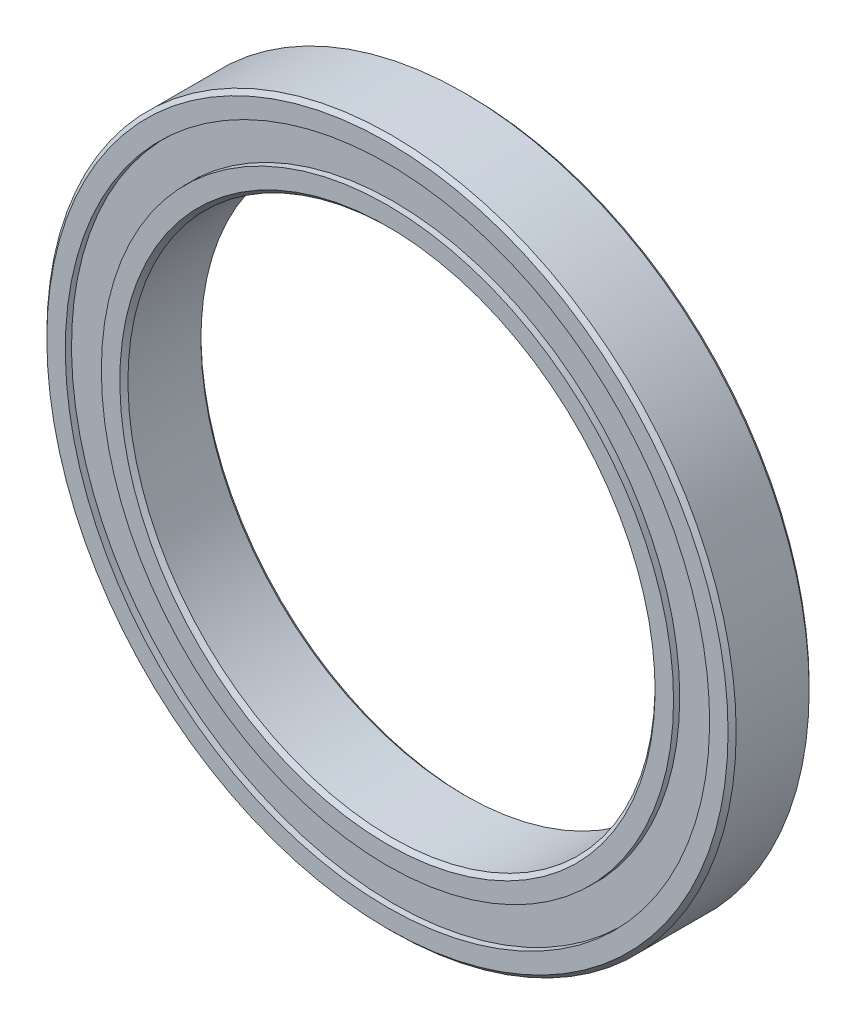
ISO-10303-21;
HEADER;
FILE_DESCRIPTION(('STEP AP214'),'2;1');
FILE_NAME('part.step','',(''),(''),'','','');
FILE_SCHEMA(('AUTOMOTIVE_DESIGN { 1 0 10303 214 1 1 1 1 }'));
ENDSEC;
DATA;
#1=APPLICATION_CONTEXT('core data for automotive mechanical design processes');
#2=APPLICATION_PROTOCOL_DEFINITION('international standard','automotive_design',2000,#1);
#3=PRODUCT_CONTEXT('',#1,'mechanical');
#4=PRODUCT('Part','Part','',(#3));
#5=PRODUCT_RELATED_PRODUCT_CATEGORY('part','',(#4));
#6=PRODUCT_DEFINITION_FORMATION('','',#4);
#7=PRODUCT_DEFINITION_CONTEXT('part definition',#1,'design');
#8=PRODUCT_DEFINITION('design','',#6,#7);
#9=PRODUCT_DEFINITION_SHAPE('','',#8);
#10=(LENGTH_UNIT() NAMED_UNIT(*) SI_UNIT(.MILLI.,.METRE.));
#11=(NAMED_UNIT(*) PLANE_ANGLE_UNIT() SI_UNIT($,.RADIAN.));
#12=(NAMED_UNIT(*) SI_UNIT($,.STERADIAN.) SOLID_ANGLE_UNIT());
#13=UNCERTAINTY_MEASURE_WITH_UNIT(LENGTH_MEASURE(1.E-05),#10,'distance_accuracy_value','');
#14=(GEOMETRIC_REPRESENTATION_CONTEXT(3) GLOBAL_UNCERTAINTY_ASSIGNED_CONTEXT((#13)) GLOBAL_UNIT_ASSIGNED_CONTEXT((#10,
#11,#12)) REPRESENTATION_CONTEXT('',''));
#15=CARTESIAN_POINT('',(0.,0.,0.));
#16=DIRECTION('',(0.,0.,1.));
#17=DIRECTION('',(1.,0.,0.));
#18=AXIS2_PLACEMENT_3D('',#15,#16,#17);
#19=CARTESIAN_POINT('',(10.1173789183879,36.1093982755426,0.));
#20=DIRECTION('',(0.,0.,1.));
#21=DIRECTION('',(0.269796771157012,0.962917287347803,0.));
#22=AXIS2_PLACEMENT_3D('',#19,#20,#21);
#23=SPHERICAL_SURFACE('',#22,3.14269680527354);
#24=CARTESIAN_POINT('',(10.1173789183879,36.1093982755426,3.14269680527354));
#25=VERTEX_POINT('',#24);
#26=VERTEX_LOOP('',#25);
#27=FACE_BOUND('',#26,.T.);
#28=ADVANCED_FACE('F47',(#27),#23,.T.);
#29=CLOSED_SHELL('',(#28));
#30=MANIFOLD_SOLID_BREP('B2',#29);
#31=CARTESIAN_POINT('',(19.4843981263284,32.0407276704936,0.));
#32=DIRECTION('',(0.,0.,1.));
#33=DIRECTION('',(0.519583950035423,0.854419404546495,0.));
#34=AXIS2_PLACEMENT_3D('',#31,#32,#33);
#35=SPHERICAL_SURFACE('',#34,3.14269680527354);
#36=CARTESIAN_POINT('',(19.4843981263284,32.0407276704936,3.14269680527354));
#37=VERTEX_POINT('',#36);
#38=VERTEX_LOOP('',#37);
#39=FACE_BOUND('',#38,.T.);
#40=ADVANCED_FACE('F67',(#39),#35,.T.);
#41=CLOSED_SHELL('',(#40));
#42=MANIFOLD_SOLID_BREP('B6',#41);
#43=CARTESIAN_POINT('',(27.4063486604294,25.5957428706999,0.));
#44=DIRECTION('',(0.,0.,1.));
#45=DIRECTION('',(0.730835964278116,0.682553143218663,0.));
#46=AXIS2_PLACEMENT_3D('',#43,#44,#45);
#47=SPHERICAL_SURFACE('',#46,3.14269680527354);
#48=CARTESIAN_POINT('',(27.4063486604294,25.5957428706999,3.14269680527354));
#49=VERTEX_POINT('',#48);
#50=VERTEX_LOOP('',#49);
#51=FACE_BOUND('',#50,.T.);
#52=ADVANCED_FACE('F87',(#51),#47,.T.);
#53=CLOSED_SHELL('',(#52));
#54=MANIFOLD_SOLID_BREP('B43',#53);
#55=CARTESIAN_POINT('',(33.2956956900889,17.2524389149186,0.));
#56=DIRECTION('',(0.,0.,1.));
#57=DIRECTION('',(0.88788521840237,0.460065037731162,0.));
#58=AXIS2_PLACEMENT_3D('',#55,#56,#57);
#59=SPHERICAL_SURFACE('',#58,3.14269680527354);
#60=CARTESIAN_POINT('',(33.2956956900889,17.2524389149186,3.14269680527354));
#61=VERTEX_POINT('',#60);
#62=VERTEX_LOOP('',#61);
#63=FACE_BOUND('',#62,.T.);
#64=ADVANCED_FACE('F107',(#63),#59,.T.);
#65=CLOSED_SHELL('',(#64));
#66=MANIFOLD_SOLID_BREP('B63',#65);
#67=CARTESIAN_POINT('',(36.715653288087,7.62960048947418,0.));
#68=DIRECTION('',(0.,0.,1.));
#69=DIRECTION('',(0.979084087682321,0.203456013052645,0.));
#70=AXIS2_PLACEMENT_3D('',#67,#68,#69);
#71=SPHERICAL_SURFACE('',#70,3.14269680527354);
#72=CARTESIAN_POINT('',(36.715653288087,7.62960048947418,3.14269680527354));
#73=VERTEX_POINT('',#72);
#74=VERTEX_LOOP('',#73);
#75=FACE_BOUND('',#74,.T.);
#76=ADVANCED_FACE('F127',(#75),#71,.T.);
#77=CLOSED_SHELL('',(#76));
#78=MANIFOLD_SOLID_BREP('B83',#77);
#79=CARTESIAN_POINT('',(37.4125788446453,-2.55909050117478,0.));
#80=DIRECTION('',(0.,0.,1.));
#81=DIRECTION('',(0.99766876919054,-0.0682424133646607,0.));
#82=AXIS2_PLACEMENT_3D('',#79,#80,#81);
#83=SPHERICAL_SURFACE('',#82,3.14269680527354);
#84=CARTESIAN_POINT('',(37.4125788446453,-2.55909050117478,3.14269680527354));
#85=VERTEX_POINT('',#84);
#86=VERTEX_LOOP('',#85);
#87=FACE_BOUND('',#86,.T.);
#88=ADVANCED_FACE('F147',(#87),#83,.T.);
#89=CLOSED_SHELL('',(#88));
#90=MANIFOLD_SOLID_BREP('B103',#89);
#91=CARTESIAN_POINT('',(35.3347845794559,-12.5579854564116,0.));
#92=DIRECTION('',(0.,0.,1.));
#93=DIRECTION('',(0.942260922118824,-0.334879612170977,0.));
#94=AXIS2_PLACEMENT_3D('',#91,#92,#93);
#95=SPHERICAL_SURFACE('',#94,3.14269680527354);
#96=CARTESIAN_POINT('',(35.3347845794559,-12.5579854564116,3.14269680527354));
#97=VERTEX_POINT('',#96);
#98=VERTEX_LOOP('',#97);
#99=FACE_BOUND('',#98,.T.);
#100=ADVANCED_FACE('F169',(#99),#95,.T.);
#101=CLOSED_SHELL('',(#100));
#102=MANIFOLD_SOLID_BREP('B123',#101);
#103=CARTESIAN_POINT('',(30.6363709878918,-21.6255120793073,0.));
#104=DIRECTION('',(0.,0.,1.));
#105=DIRECTION('',(0.816969893010447,-0.57668032211486,0.));
#106=AXIS2_PLACEMENT_3D('',#103,#104,#105);
#107=SPHERICAL_SURFACE('',#106,3.14269680527354);
#108=CARTESIAN_POINT('',(30.6363709878918,-21.6255120793073,3.14269680527353));
#109=VERTEX_POINT('',#108);
#110=VERTEX_LOOP('',#109);
#111=FACE_BOUND('',#110,.T.);
#112=ADVANCED_FACE('F191',(#111),#107,.T.);
#113=CLOSED_SHELL('',(#112));
#114=MANIFOLD_SOLID_BREP('B143',#113);
#115=CARTESIAN_POINT('',(23.6657979122272,-29.0891734014155,0.));
#116=DIRECTION('',(0.,0.,1.));
#117=DIRECTION('',(0.631087944326059,-0.775711290704414,0.));
#118=AXIS2_PLACEMENT_3D('',#115,#116,#117);
#119=SPHERICAL_SURFACE('',#118,3.14269680527354);
#120=CARTESIAN_POINT('',(23.6657979122272,-29.0891734014155,3.14269680527353));
#121=VERTEX_POINT('',#120);
#122=VERTEX_LOOP('',#121);
#123=FACE_BOUND('',#122,.T.);
#124=ADVANCED_FACE('F213',(#123),#119,.T.);
#125=CLOSED_SHELL('',(#124));
#126=MANIFOLD_SOLID_BREP('B165',#125);
#127=CARTESIAN_POINT('',(14.9400408692343,-34.3954238064544,0.));
#128=DIRECTION('',(0.,0.,1.));
#129=DIRECTION('',(0.398401089846249,-0.91721130150545,0.));
#130=AXIS2_PLACEMENT_3D('',#127,#128,#129);
#131=SPHERICAL_SURFACE('',#130,3.14269680527354);
#132=CARTESIAN_POINT('',(14.9400408692343,-34.3954238064544,3.14269680527353));
#133=VERTEX_POINT('',#132);
#134=VERTEX_LOOP('',#133);
#135=FACE_BOUND('',#134,.T.);
#136=ADVANCED_FACE('F235',(#135),#131,.T.);
#137=CLOSED_SHELL('',(#136));
#138=MANIFOLD_SOLID_BREP('B187',#137);
#139=CARTESIAN_POINT('',(5.10624934110952,-37.1507229763624,0.));
#140=DIRECTION('',(0.,0.,1.));
#141=DIRECTION('',(0.136166649096254,-0.99068594603633,0.));
#142=AXIS2_PLACEMENT_3D('',#139,#140,#141);
#143=SPHERICAL_SURFACE('',#142,3.14269680527354);
#144=CARTESIAN_POINT('',(5.10624934110952,-37.1507229763624,3.14269680527353));
#145=VERTEX_POINT('',#144);
#146=VERTEX_LOOP('',#145);
#147=FACE_BOUND('',#146,.T.);
#148=ADVANCED_FACE('F257',(#147),#143,.T.);
#149=CLOSED_SHELL('',(#148));
#150=MANIFOLD_SOLID_BREP('B209',#149);
#151=CARTESIAN_POINT('',(-5.106249341109,-37.1507229763624,0.));
#152=DIRECTION('',(0.,0.,1.));
#153=DIRECTION('',(-0.13616664909624,-0.990685946036332,0.));
#154=AXIS2_PLACEMENT_3D('',#151,#152,#153);
#155=SPHERICAL_SURFACE('',#154,3.14269680527354);
#156=CARTESIAN_POINT('',(-5.106249341109,-37.1507229763624,3.14269680527353));
#157=VERTEX_POINT('',#156);
#158=VERTEX_LOOP('',#157);
#159=FACE_BOUND('',#158,.T.);
#160=ADVANCED_FACE('F279',(#159),#155,.T.);
#161=CLOSED_SHELL('',(#160));
#162=MANIFOLD_SOLID_BREP('B231',#161);
#163=CARTESIAN_POINT('',(-14.9400408692339,-34.3954238064546,0.));
#164=DIRECTION('',(0.,0.,1.));
#165=DIRECTION('',(-0.398401089846236,-0.917211301505455,0.));
#166=AXIS2_PLACEMENT_3D('',#163,#164,#165);
#167=SPHERICAL_SURFACE('',#166,3.14269680527354);
#168=CARTESIAN_POINT('',(-14.9400408692339,-34.3954238064546,3.14269680527353));
#169=VERTEX_POINT('',#168);
#170=VERTEX_LOOP('',#169);
#171=FACE_BOUND('',#170,.T.);
#172=ADVANCED_FACE('F301',(#171),#167,.T.);
#173=CLOSED_SHELL('',(#172));
#174=MANIFOLD_SOLID_BREP('B253',#173);
#175=CARTESIAN_POINT('',(-23.6657979122268,-29.0891734014159,0.));
#176=DIRECTION('',(0.,0.,1.));
#177=DIRECTION('',(-0.631087944326049,-0.775711290704423,0.));
#178=AXIS2_PLACEMENT_3D('',#175,#176,#177);
#179=SPHERICAL_SURFACE('',#178,3.14269680527354);
#180=CARTESIAN_POINT('',(-23.6657979122268,-29.0891734014159,3.14269680527353));
#181=VERTEX_POINT('',#180);
#182=VERTEX_LOOP('',#181);
#183=FACE_BOUND('',#182,.T.);
#184=ADVANCED_FACE('F323',(#183),#179,.T.);
#185=CLOSED_SHELL('',(#184));
#186=MANIFOLD_SOLID_BREP('B275',#185);
#187=CARTESIAN_POINT('',(-30.6363709878915,-21.6255120793077,0.));
#188=DIRECTION('',(0.,0.,1.));
#189=DIRECTION('',(-0.816969893010439,-0.576680322114871,0.));
#190=AXIS2_PLACEMENT_3D('',#187,#188,#189);
#191=SPHERICAL_SURFACE('',#190,3.14269680527354);
#192=CARTESIAN_POINT('',(-30.6363709878915,-21.6255120793077,3.14269680527353));
#193=VERTEX_POINT('',#192);
#194=VERTEX_LOOP('',#193);
#195=FACE_BOUND('',#194,.T.);
#196=ADVANCED_FACE('F345',(#195),#191,.T.);
#197=CLOSED_SHELL('',(#196));
#198=MANIFOLD_SOLID_BREP('B297',#197);
#199=CARTESIAN_POINT('',(-35.3347845794557,-12.5579854564121,0.));
#200=DIRECTION('',(0.,0.,1.));
#201=DIRECTION('',(-0.942260922118819,-0.33487961217099,0.));
#202=AXIS2_PLACEMENT_3D('',#199,#200,#201);
#203=SPHERICAL_SURFACE('',#202,3.14269680527354);
#204=CARTESIAN_POINT('',(-35.3347845794557,-12.5579854564121,3.14269680527354));
#205=VERTEX_POINT('',#204);
#206=VERTEX_LOOP('',#205);
#207=FACE_BOUND('',#206,.T.);
#208=ADVANCED_FACE('F367',(#207),#203,.T.);
#209=CLOSED_SHELL('',(#208));
#210=MANIFOLD_SOLID_BREP('B319',#209);
#211=CARTESIAN_POINT('',(-37.4125788446452,-2.5590905011753,0.));
#212=DIRECTION('',(0.,0.,1.));
#213=DIRECTION('',(-0.997668769190539,-0.0682424133646747,0.));
#214=AXIS2_PLACEMENT_3D('',#211,#212,#213);
#215=SPHERICAL_SURFACE('',#214,3.14269680527354);
#216=CARTESIAN_POINT('',(-37.4125788446452,-2.5590905011753,3.14269680527354));
#217=VERTEX_POINT('',#216);
#218=VERTEX_LOOP('',#217);
#219=FACE_BOUND('',#218,.T.);
#220=ADVANCED_FACE('F389',(#219),#215,.T.);
#221=CLOSED_SHELL('',(#220));
#222=MANIFOLD_SOLID_BREP('B341',#221);
#223=CARTESIAN_POINT('',(-36.7156532880871,7.62960048947366,0.));
#224=DIRECTION('',(0.,0.,1.));
#225=DIRECTION('',(-0.979084087682323,0.203456013052631,0.));
#226=AXIS2_PLACEMENT_3D('',#223,#224,#225);
#227=SPHERICAL_SURFACE('',#226,3.14269680527354);
#228=CARTESIAN_POINT('',(-36.7156532880871,7.62960048947366,3.14269680527354));
#229=VERTEX_POINT('',#228);
#230=VERTEX_LOOP('',#229);
#231=FACE_BOUND('',#230,.T.);
#232=ADVANCED_FACE('F411',(#231),#227,.T.);
#233=CLOSED_SHELL('',(#232));
#234=MANIFOLD_SOLID_BREP('B363',#233);
#235=CARTESIAN_POINT('',(-33.2956956900891,17.2524389149181,0.));
#236=DIRECTION('',(0.,0.,1.));
#237=DIRECTION('',(-0.887885218402376,0.46006503773115,0.));
#238=AXIS2_PLACEMENT_3D('',#235,#236,#237);
#239=SPHERICAL_SURFACE('',#238,3.14269680527354);
#240=CARTESIAN_POINT('',(-33.2956956900891,17.2524389149181,3.14269680527354));
#241=VERTEX_POINT('',#240);
#242=VERTEX_LOOP('',#241);
#243=FACE_BOUND('',#242,.T.);
#244=ADVANCED_FACE('F433',(#243),#239,.T.);
#245=CLOSED_SHELL('',(#244));
#246=MANIFOLD_SOLID_BREP('B385',#245);
#247=CARTESIAN_POINT('',(-27.4063486604297,25.5957428706995,0.));
#248=DIRECTION('',(0.,0.,1.));
#249=DIRECTION('',(-0.730835964278125,0.682553143218653,0.));
#250=AXIS2_PLACEMENT_3D('',#247,#248,#249);
#251=SPHERICAL_SURFACE('',#250,3.14269680527354);
#252=CARTESIAN_POINT('',(-27.4063486604297,25.5957428706995,3.14269680527354));
#253=VERTEX_POINT('',#252);
#254=VERTEX_LOOP('',#253);
#255=FACE_BOUND('',#254,.T.);
#256=ADVANCED_FACE('F455',(#255),#251,.T.);
#257=CLOSED_SHELL('',(#256));
#258=MANIFOLD_SOLID_BREP('B407',#257);
#259=CARTESIAN_POINT('',(-19.4843981263288,32.0407276704933,0.));
#260=DIRECTION('',(0.,0.,1.));
#261=DIRECTION('',(-0.519583950035435,0.854419404546488,0.));
#262=AXIS2_PLACEMENT_3D('',#259,#260,#261);
#263=SPHERICAL_SURFACE('',#262,3.14269680527354);
#264=CARTESIAN_POINT('',(-19.4843981263288,32.0407276704933,3.14269680527354));
#265=VERTEX_POINT('',#264);
#266=VERTEX_LOOP('',#265);
#267=FACE_BOUND('',#266,.T.);
#268=ADVANCED_FACE('F477',(#267),#263,.T.);
#269=CLOSED_SHELL('',(#268));
#270=MANIFOLD_SOLID_BREP('B429',#269);
#271=CARTESIAN_POINT('',(-10.1173789183884,36.1093982755425,0.));
#272=DIRECTION('',(0.,0.,1.));
#273=DIRECTION('',(-0.269796771157025,0.962917287347799,0.));
#274=AXIS2_PLACEMENT_3D('',#271,#272,#273);
#275=SPHERICAL_SURFACE('',#274,3.14269680527354);
#276=CARTESIAN_POINT('',(-10.1173789183884,36.1093982755425,3.14269680527354));
#277=VERTEX_POINT('',#276);
#278=VERTEX_LOOP('',#277);
#279=FACE_BOUND('',#278,.T.);
#280=ADVANCED_FACE('F499',(#279),#275,.T.);
#281=CLOSED_SHELL('',(#280));
#282=MANIFOLD_SOLID_BREP('B451',#281);
#283=CARTESIAN_POINT('',(0.,37.5,0.));
#284=DIRECTION('',(0.,0.,1.));
#285=DIRECTION('',(0.,1.,0.));
#286=AXIS2_PLACEMENT_3D('',#283,#284,#285);
#287=SPHERICAL_SURFACE('',#286,3.14269680527354);
#288=CARTESIAN_POINT('',(0.,37.5,3.14269680527354));
#289=VERTEX_POINT('',#288);
#290=VERTEX_LOOP('',#289);
#291=FACE_BOUND('',#290,.T.);
#292=ADVANCED_FACE('F523',(#291),#287,.T.);
#293=CLOSED_SHELL('',(#292));
#294=MANIFOLD_SOLID_BREP('B473',#293);
#295=CARTESIAN_POINT('',(0.,35.2777777777778,5.00000000000002));
#296=DIRECTION('',(0.,0.,-1.));
#297=DIRECTION('',(0.,1.,0.));
#298=AXIS2_PLACEMENT_3D('',#295,#296,#297);
#299=PLANE('',#298);
#300=CARTESIAN_POINT('',(0.,0.,5.00000000000002));
#301=DIRECTION('',(0.,0.,1.));
#302=DIRECTION('',(0.,-1.,0.));
#303=AXIS2_PLACEMENT_3D('',#300,#301,#302);
#304=CIRCLE('',#303,33.);
#305=CARTESIAN_POINT('',(0.,-33.,5.00000000000002));
#306=VERTEX_POINT('',#305);
#307=EDGE_CURVE('E582',#306,#306,#304,.T.);
#308=ORIENTED_EDGE('',*,*,#307,.F.);
#309=EDGE_LOOP('',(#308));
#310=FACE_BOUND('',#309,.T.);
#311=CARTESIAN_POINT('',(0.,0.,5.00000000000002));
#312=DIRECTION('',(0.,0.,1.));
#313=DIRECTION('',(0.,-1.,0.));
#314=AXIS2_PLACEMENT_3D('',#311,#312,#313);
#315=CIRCLE('',#314,35.2777777777778);
#316=CARTESIAN_POINT('',(0.,-35.2777777777778,5.00000000000002));
#317=VERTEX_POINT('',#316);
#318=EDGE_CURVE('E522',#317,#317,#315,.T.);
#319=ORIENTED_EDGE('',*,*,#318,.T.);
#320=EDGE_LOOP('',(#319));
#321=FACE_BOUND('',#320,.T.);
#322=ADVANCED_FACE('F545',(#310,#321),#299,.F.);
#323=CARTESIAN_POINT('',(0.,0.,5.00000000000002));
#324=DIRECTION('',(0.,0.,1.));
#325=DIRECTION('',(0.,-1.,0.));
#326=AXIS2_PLACEMENT_3D('',#323,#324,#325);
#327=CYLINDRICAL_SURFACE('',#326,35.2777777777778);
#328=ORIENTED_EDGE('',*,*,#318,.F.);
#329=EDGE_LOOP('',(#328));
#330=FACE_BOUND('',#329,.T.);
#331=CARTESIAN_POINT('',(0.,0.,2.22222222222222));
#332=DIRECTION('',(0.,0.,1.));
#333=DIRECTION('',(0.,-1.,0.));
#334=AXIS2_PLACEMENT_3D('',#331,#332,#333);
#335=CIRCLE('',#334,35.2777777777778);
#336=CARTESIAN_POINT('',(0.,-35.2777777777778,2.22222222222221));
#337=VERTEX_POINT('',#336);
#338=EDGE_CURVE('E552',#337,#337,#335,.T.);
#339=ORIENTED_EDGE('',*,*,#338,.T.);
#340=EDGE_LOOP('',(#339));
#341=FACE_BOUND('',#340,.T.);
#342=ADVANCED_FACE('F591',(#330,#341),#327,.T.);
#343=CARTESIAN_POINT('',(0.,0.,0.));
#344=DIRECTION('',(0.,0.,1.));
#345=DIRECTION('',(0.,-1.,0.));
#346=AXIS2_PLACEMENT_3D('',#343,#344,#345);
#347=TOROIDAL_SURFACE('',#346,37.5,3.14269680527354);
#348=ORIENTED_EDGE('',*,*,#338,.F.);
#349=EDGE_LOOP('',(#348));
#350=FACE_BOUND('',#349,.T.);
#351=CARTESIAN_POINT('',(0.,0.,-2.22222222222223));
#352=DIRECTION('',(0.,0.,1.));
#353=DIRECTION('',(0.,-1.,0.));
#354=AXIS2_PLACEMENT_3D('',#351,#352,#353);
#355=CIRCLE('',#354,35.2777777777778);
#356=CARTESIAN_POINT('',(0.,-35.2777777777778,-2.22222222222223));
#357=VERTEX_POINT('',#356);
#358=EDGE_CURVE('E558',#357,#357,#355,.T.);
#359=ORIENTED_EDGE('',*,*,#358,.T.);
#360=EDGE_LOOP('',(#359));
#361=FACE_BOUND('',#360,.T.);
#362=ADVANCED_FACE('F595',(#350,#361),#347,.F.);
#363=CARTESIAN_POINT('',(0.,0.,5.00000000000002));
#364=DIRECTION('',(0.,0.,1.));
#365=DIRECTION('',(0.,-1.,0.));
#366=AXIS2_PLACEMENT_3D('',#363,#364,#365);
#367=CYLINDRICAL_SURFACE('',#366,35.2777777777778);
#368=ORIENTED_EDGE('',*,*,#358,.F.);
#369=EDGE_LOOP('',(#368));
#370=FACE_BOUND('',#369,.T.);
#371=CARTESIAN_POINT('',(0.,0.,-5.00000000000003));
#372=DIRECTION('',(0.,0.,1.));
#373=DIRECTION('',(0.,-1.,0.));
#374=AXIS2_PLACEMENT_3D('',#371,#372,#373);
#375=CIRCLE('',#374,35.2777777777778);
#376=CARTESIAN_POINT('',(0.,-35.2777777777778,-5.00000000000003));
#377=VERTEX_POINT('',#376);
#378=EDGE_CURVE('E564',#377,#377,#375,.T.);
#379=ORIENTED_EDGE('',*,*,#378,.T.);
#380=EDGE_LOOP('',(#379));
#381=FACE_BOUND('',#380,.T.);
#382=ADVANCED_FACE('F600',(#370,#381),#367,.T.);
#383=CARTESIAN_POINT('',(0.,33.,-5.00000000000003));
#384=DIRECTION('',(0.,0.,1.));
#385=DIRECTION('',(0.,-1.,0.));
#386=AXIS2_PLACEMENT_3D('',#383,#384,#385);
#387=PLANE('',#386);
#388=ORIENTED_EDGE('',*,*,#378,.F.);
#389=EDGE_LOOP('',(#388));
#390=FACE_BOUND('',#389,.T.);
#391=CARTESIAN_POINT('',(0.,0.,-5.00000000000003));
#392=DIRECTION('',(0.,0.,1.));
#393=DIRECTION('',(0.,-1.,0.));
#394=AXIS2_PLACEMENT_3D('',#391,#392,#393);
#395=CIRCLE('',#394,33.);
#396=CARTESIAN_POINT('',(0.,-33.,-5.00000000000004));
#397=VERTEX_POINT('',#396);
#398=EDGE_CURVE('E570',#397,#397,#395,.T.);
#399=ORIENTED_EDGE('',*,*,#398,.T.);
#400=EDGE_LOOP('',(#399));
#401=FACE_BOUND('',#400,.T.);
#402=ADVANCED_FACE('F606',(#390,#401),#387,.F.);
#403=CARTESIAN_POINT('',(0.,0.,-4.50000000000002));
#404=DIRECTION('',(0.,0.,-1.));
#405=DIRECTION('',(0.,1.,0.));
#406=AXIS2_PLACEMENT_3D('',#403,#404,#405);
#407=CONICAL_SURFACE('',#406,32.5,0.785398163397434);
#408=ORIENTED_EDGE('',*,*,#398,.F.);
#409=EDGE_LOOP('',(#408));
#410=FACE_BOUND('',#409,.T.);
#411=CARTESIAN_POINT('',(0.,0.,-4.50000000000002));
#412=DIRECTION('',(0.,0.,1.));
#413=DIRECTION('',(0.,-1.,0.));
#414=AXIS2_PLACEMENT_3D('',#411,#412,#413);
#415=CIRCLE('',#414,32.5);
#416=CARTESIAN_POINT('',(0.,-32.5,-4.50000000000003));
#417=VERTEX_POINT('',#416);
#418=EDGE_CURVE('E574',#417,#417,#415,.T.);
#419=ORIENTED_EDGE('',*,*,#418,.T.);
#420=EDGE_LOOP('',(#419));
#421=FACE_BOUND('',#420,.T.);
#422=ADVANCED_FACE('F610',(#410,#421),#407,.F.);
#423=CARTESIAN_POINT('',(0.,0.,5.00000000000002));
#424=DIRECTION('',(0.,0.,1.));
#425=DIRECTION('',(0.,-1.,0.));
#426=AXIS2_PLACEMENT_3D('',#423,#424,#425);
#427=CYLINDRICAL_SURFACE('',#426,32.5);
#428=ORIENTED_EDGE('',*,*,#418,.F.);
#429=EDGE_LOOP('',(#428));
#430=FACE_BOUND('',#429,.T.);
#431=CARTESIAN_POINT('',(0.,0.,4.50000000000003));
#432=DIRECTION('',(0.,0.,1.));
#433=DIRECTION('',(0.,-1.,0.));
#434=AXIS2_PLACEMENT_3D('',#431,#432,#433);
#435=CIRCLE('',#434,32.5);
#436=CARTESIAN_POINT('',(0.,-32.5,4.50000000000003));
#437=VERTEX_POINT('',#436);
#438=EDGE_CURVE('E578',#437,#437,#435,.T.);
#439=ORIENTED_EDGE('',*,*,#438,.T.);
#440=EDGE_LOOP('',(#439));
#441=FACE_BOUND('',#440,.T.);
#442=ADVANCED_FACE('F614',(#430,#441),#427,.F.);
#443=CARTESIAN_POINT('',(0.,0.,5.00000000000002));
#444=DIRECTION('',(0.,0.,1.));
#445=DIRECTION('',(0.,-1.,0.));
#446=AXIS2_PLACEMENT_3D('',#443,#444,#445);
#447=CONICAL_SURFACE('',#446,33.,0.785398163397475);
#448=ORIENTED_EDGE('',*,*,#438,.F.);
#449=EDGE_LOOP('',(#448));
#450=FACE_BOUND('',#449,.T.);
#451=ORIENTED_EDGE('',*,*,#307,.T.);
#452=EDGE_LOOP('',(#451));
#453=FACE_BOUND('',#452,.T.);
#454=ADVANCED_FACE('F588',(#450,#453),#447,.F.);
#455=CLOSED_SHELL('',(#322,#342,#362,#382,#402,#422,#442,#454));
#456=MANIFOLD_SOLID_BREP('B495',#455);
#457=CARTESIAN_POINT('',(0.,35.3031777777778,-3.88084840263679));
#458=DIRECTION('',(0.,0.,-1.));
#459=DIRECTION('',(0.,1.,0.));
#460=AXIS2_PLACEMENT_3D('',#457,#458,#459);
#461=PLANE('',#460);
#462=CARTESIAN_POINT('',(0.,0.,-3.88084840263679));
#463=DIRECTION('',(0.,0.,1.));
#464=DIRECTION('',(0.,-1.,0.));
#465=AXIS2_PLACEMENT_3D('',#462,#463,#464);
#466=CIRCLE('',#465,35.3031777777778);
#467=CARTESIAN_POINT('',(0.,-35.3031777777778,-3.88084840263679));
#468=VERTEX_POINT('',#467);
#469=EDGE_CURVE('E725',#468,#468,#466,.T.);
#470=ORIENTED_EDGE('',*,*,#469,.F.);
#471=EDGE_LOOP('',(#470));
#472=FACE_BOUND('',#471,.T.);
#473=CARTESIAN_POINT('',(0.,0.,-3.88084840263679));
#474=DIRECTION('',(0.,0.,1.));
#475=DIRECTION('',(0.,-1.,0.));
#476=AXIS2_PLACEMENT_3D('',#473,#474,#475);
#477=CIRCLE('',#476,39.6968222222222);
#478=CARTESIAN_POINT('',(0.,-39.6968222222222,-3.8808484026368));
#479=VERTEX_POINT('',#478);
#480=EDGE_CURVE('E544',#479,#479,#477,.T.);
#481=ORIENTED_EDGE('',*,*,#480,.T.);
#482=EDGE_LOOP('',(#481));
#483=FACE_BOUND('',#482,.T.);
#484=ADVANCED_FACE('F706',(#472,#483),#461,.F.);
#485=CARTESIAN_POINT('',(0.,0.,5.00000000000002));
#486=DIRECTION('',(0.,0.,1.));
#487=DIRECTION('',(0.,-1.,0.));
#488=AXIS2_PLACEMENT_3D('',#485,#486,#487);
#489=CYLINDRICAL_SURFACE('',#488,39.6968222222222);
#490=ORIENTED_EDGE('',*,*,#480,.F.);
#491=EDGE_LOOP('',(#490));
#492=FACE_BOUND('',#491,.T.);
#493=CARTESIAN_POINT('',(0.,0.,-4.26184840263679));
#494=DIRECTION('',(0.,0.,1.));
#495=DIRECTION('',(0.,-1.,0.));
#496=AXIS2_PLACEMENT_3D('',#493,#494,#495);
#497=CIRCLE('',#496,39.6968222222222);
#498=CARTESIAN_POINT('',(0.,-39.6968222222222,-4.2618484026368));
#499=VERTEX_POINT('',#498);
#500=EDGE_CURVE('E713',#499,#499,#497,.T.);
#501=ORIENTED_EDGE('',*,*,#500,.T.);
#502=EDGE_LOOP('',(#501));
#503=FACE_BOUND('',#502,.T.);
#504=ADVANCED_FACE('F736',(#492,#503),#489,.T.);
#505=CARTESIAN_POINT('',(0.,35.3031777777778,-4.26184840263679));
#506=DIRECTION('',(0.,0.,1.));
#507=DIRECTION('',(0.,-1.,0.));
#508=AXIS2_PLACEMENT_3D('',#505,#506,#507);
#509=PLANE('',#508);
#510=ORIENTED_EDGE('',*,*,#500,.F.);
#511=EDGE_LOOP('',(#510));
#512=FACE_BOUND('',#511,.T.);
#513=CARTESIAN_POINT('',(0.,0.,-4.26184840263679));
#514=DIRECTION('',(0.,0.,1.));
#515=DIRECTION('',(0.,-1.,0.));
#516=AXIS2_PLACEMENT_3D('',#513,#514,#515);
#517=CIRCLE('',#516,35.3031777777778);
#518=CARTESIAN_POINT('',(0.,-35.3031777777778,-4.26184840263679));
#519=VERTEX_POINT('',#518);
#520=EDGE_CURVE('E719',#519,#519,#517,.T.);
#521=ORIENTED_EDGE('',*,*,#520,.T.);
#522=EDGE_LOOP('',(#521));
#523=FACE_BOUND('',#522,.T.);
#524=ADVANCED_FACE('F740',(#512,#523),#509,.F.);
#525=CARTESIAN_POINT('',(0.,0.,5.00000000000002));
#526=DIRECTION('',(0.,0.,1.));
#527=DIRECTION('',(0.,-1.,0.));
#528=AXIS2_PLACEMENT_3D('',#525,#526,#527);
#529=CYLINDRICAL_SURFACE('',#528,35.3031777777778);
#530=ORIENTED_EDGE('',*,*,#520,.F.);
#531=EDGE_LOOP('',(#530));
#532=FACE_BOUND('',#531,.T.);
#533=ORIENTED_EDGE('',*,*,#469,.T.);
#534=EDGE_LOOP('',(#533));
#535=FACE_BOUND('',#534,.T.);
#536=ADVANCED_FACE('F733',(#532,#535),#529,.F.);
#537=CLOSED_SHELL('',(#484,#504,#524,#536));
#538=MANIFOLD_SOLID_BREP('B517',#537);
#539=CARTESIAN_POINT('',(0.,35.3031777777778,4.26184840263678));
#540=DIRECTION('',(0.,0.,-1.));
#541=DIRECTION('',(0.,1.,0.));
#542=AXIS2_PLACEMENT_3D('',#539,#540,#541);
#543=PLANE('',#542);
#544=CARTESIAN_POINT('',(0.,0.,4.26184840263678));
#545=DIRECTION('',(0.,0.,1.));
#546=DIRECTION('',(0.,-1.,0.));
#547=AXIS2_PLACEMENT_3D('',#544,#545,#546);
#548=CIRCLE('',#547,35.3031777777778);
#549=CARTESIAN_POINT('',(0.,-35.3031777777778,4.26184840263677));
#550=VERTEX_POINT('',#549);
#551=EDGE_CURVE('E705',#550,#550,#548,.T.);
#552=ORIENTED_EDGE('',*,*,#551,.F.);
#553=EDGE_LOOP('',(#552));
#554=FACE_BOUND('',#553,.T.);
#555=CARTESIAN_POINT('',(0.,0.,4.26184840263678));
#556=DIRECTION('',(0.,0.,1.));
#557=DIRECTION('',(0.,-1.,0.));
#558=AXIS2_PLACEMENT_3D('',#555,#556,#557);
#559=CIRCLE('',#558,39.6968222222222);
#560=CARTESIAN_POINT('',(0.,-39.6968222222222,4.26184840263677));
#561=VERTEX_POINT('',#560);
#562=EDGE_CURVE('E809',#561,#561,#559,.T.);
#563=ORIENTED_EDGE('',*,*,#562,.T.);
#564=EDGE_LOOP('',(#563));
#565=FACE_BOUND('',#564,.T.);
#566=ADVANCED_FACE('F790',(#554,#565),#543,.F.);
#567=CARTESIAN_POINT('',(0.,0.,5.00000000000002));
#568=DIRECTION('',(0.,0.,1.));
#569=DIRECTION('',(0.,-1.,0.));
#570=AXIS2_PLACEMENT_3D('',#567,#568,#569);
#571=CYLINDRICAL_SURFACE('',#570,35.3031777777778);
#572=CARTESIAN_POINT('',(0.,0.,3.88084840263678));
#573=DIRECTION('',(0.,0.,1.));
#574=DIRECTION('',(0.,-1.,0.));
#575=AXIS2_PLACEMENT_3D('',#572,#573,#574);
#576=CIRCLE('',#575,35.3031777777778);
#577=CARTESIAN_POINT('',(0.,-35.3031777777778,3.88084840263677));
#578=VERTEX_POINT('',#577);
#579=EDGE_CURVE('E797',#578,#578,#576,.T.);
#580=ORIENTED_EDGE('',*,*,#579,.F.);
#581=EDGE_LOOP('',(#580));
#582=FACE_BOUND('',#581,.T.);
#583=ORIENTED_EDGE('',*,*,#551,.T.);
#584=EDGE_LOOP('',(#583));
#585=FACE_BOUND('',#584,.T.);
#586=ADVANCED_FACE('F826',(#582,#585),#571,.F.);
#587=CARTESIAN_POINT('',(0.,35.3031777777778,3.88084840263678));
#588=DIRECTION('',(0.,0.,1.));
#589=DIRECTION('',(0.,-1.,0.));
#590=AXIS2_PLACEMENT_3D('',#587,#588,#589);
#591=PLANE('',#590);
#592=CARTESIAN_POINT('',(0.,0.,3.88084840263678));
#593=DIRECTION('',(0.,0.,1.));
#594=DIRECTION('',(0.,-1.,0.));
#595=AXIS2_PLACEMENT_3D('',#592,#593,#594);
#596=CIRCLE('',#595,39.6968222222222);
#597=CARTESIAN_POINT('',(0.,-39.6968222222222,3.88084840263677));
#598=VERTEX_POINT('',#597);
#599=EDGE_CURVE('E803',#598,#598,#596,.T.);
#600=ORIENTED_EDGE('',*,*,#599,.F.);
#601=EDGE_LOOP('',(#600));
#602=FACE_BOUND('',#601,.T.);
#603=ORIENTED_EDGE('',*,*,#579,.T.);
#604=EDGE_LOOP('',(#603));
#605=FACE_BOUND('',#604,.T.);
#606=ADVANCED_FACE('F821',(#602,#605),#591,.F.);
#607=CARTESIAN_POINT('',(0.,0.,5.00000000000002));
#608=DIRECTION('',(0.,0.,1.));
#609=DIRECTION('',(0.,-1.,0.));
#610=AXIS2_PLACEMENT_3D('',#607,#608,#609);
#611=CYLINDRICAL_SURFACE('',#610,39.6968222222222);
#612=ORIENTED_EDGE('',*,*,#562,.F.);
#613=EDGE_LOOP('',(#612));
#614=FACE_BOUND('',#613,.T.);
#615=ORIENTED_EDGE('',*,*,#599,.T.);
#616=EDGE_LOOP('',(#615));
#617=FACE_BOUND('',#616,.T.);
#618=ADVANCED_FACE('F818',(#614,#617),#611,.T.);
#619=CLOSED_SHELL('',(#566,#586,#606,#618));
#620=MANIFOLD_SOLID_BREP('B539',#619);
#621=CARTESIAN_POINT('',(0.,0.,4.50000000000001));
#622=DIRECTION('',(0.,0.,-1.));
#623=DIRECTION('',(0.,1.,0.));
#624=AXIS2_PLACEMENT_3D('',#621,#622,#623);
#625=CONICAL_SURFACE('',#624,42.5,0.78539816339745);
#626=CARTESIAN_POINT('',(0.,0.,5.00000000000001));
#627=DIRECTION('',(0.,0.,1.));
#628=DIRECTION('',(0.,-1.,0.));
#629=AXIS2_PLACEMENT_3D('',#626,#627,#628);
#630=CIRCLE('',#629,42.);
#631=CARTESIAN_POINT('',(0.,-42.,5.));
#632=VERTEX_POINT('',#631);
#633=EDGE_CURVE('E904',#632,#632,#630,.T.);
#634=ORIENTED_EDGE('',*,*,#633,.F.);
#635=EDGE_LOOP('',(#634));
#636=FACE_BOUND('',#635,.T.);
#637=CARTESIAN_POINT('',(0.,0.,4.50000000000001));
#638=DIRECTION('',(0.,0.,1.));
#639=DIRECTION('',(0.,-1.,0.));
#640=AXIS2_PLACEMENT_3D('',#637,#638,#639);
#641=CIRCLE('',#640,42.5);
#642=CARTESIAN_POINT('',(0.,-42.5,4.50000000000001));
#643=VERTEX_POINT('',#642);
#644=EDGE_CURVE('E789',#643,#643,#641,.T.);
#645=ORIENTED_EDGE('',*,*,#644,.T.);
#646=EDGE_LOOP('',(#645));
#647=FACE_BOUND('',#646,.T.);
#648=ADVANCED_FACE('F867',(#636,#647),#625,.T.);
#649=CARTESIAN_POINT('',(0.,0.,5.00000000000002));
#650=DIRECTION('',(0.,0.,1.));
#651=DIRECTION('',(0.,-1.,0.));
#652=AXIS2_PLACEMENT_3D('',#649,#650,#651);
#653=CYLINDRICAL_SURFACE('',#652,42.5);
#654=ORIENTED_EDGE('',*,*,#644,.F.);
#655=EDGE_LOOP('',(#654));
#656=FACE_BOUND('',#655,.T.);
#657=CARTESIAN_POINT('',(0.,0.,-4.50000000000003));
#658=DIRECTION('',(0.,0.,1.));
#659=DIRECTION('',(0.,-1.,0.));
#660=AXIS2_PLACEMENT_3D('',#657,#658,#659);
#661=CIRCLE('',#660,42.5);
#662=CARTESIAN_POINT('',(0.,-42.5,-4.50000000000003));
#663=VERTEX_POINT('',#662);
#664=EDGE_CURVE('E874',#663,#663,#661,.T.);
#665=ORIENTED_EDGE('',*,*,#664,.T.);
#666=EDGE_LOOP('',(#665));
#667=FACE_BOUND('',#666,.T.);
#668=ADVANCED_FACE('F913',(#656,#667),#653,.T.);
#669=CARTESIAN_POINT('',(0.,0.,-5.00000000000002));
#670=DIRECTION('',(0.,0.,1.));
#671=DIRECTION('',(0.,-1.,0.));
#672=AXIS2_PLACEMENT_3D('',#669,#670,#671);
#673=CONICAL_SURFACE('',#672,42.,0.785398163397452);
#674=ORIENTED_EDGE('',*,*,#664,.F.);
#675=EDGE_LOOP('',(#674));
#676=FACE_BOUND('',#675,.T.);
#677=CARTESIAN_POINT('',(0.,0.,-5.00000000000002));
#678=DIRECTION('',(0.,0.,1.));
#679=DIRECTION('',(0.,-1.,0.));
#680=AXIS2_PLACEMENT_3D('',#677,#678,#679);
#681=CIRCLE('',#680,42.);
#682=CARTESIAN_POINT('',(0.,-42.,-5.00000000000003));
#683=VERTEX_POINT('',#682);
#684=EDGE_CURVE('E880',#683,#683,#681,.T.);
#685=ORIENTED_EDGE('',*,*,#684,.T.);
#686=EDGE_LOOP('',(#685));
#687=FACE_BOUND('',#686,.T.);
#688=ADVANCED_FACE('F917',(#676,#687),#673,.T.);
#689=CARTESIAN_POINT('',(0.,42.,-5.00000000000002));
#690=DIRECTION('',(0.,0.,1.));
#691=DIRECTION('',(0.,-1.,0.));
#692=AXIS2_PLACEMENT_3D('',#689,#690,#691);
#693=PLANE('',#692);
#694=ORIENTED_EDGE('',*,*,#684,.F.);
#695=EDGE_LOOP('',(#694));
#696=FACE_BOUND('',#695,.T.);
#697=CARTESIAN_POINT('',(0.,0.,-5.00000000000003));
#698=DIRECTION('',(0.,0.,1.));
#699=DIRECTION('',(0.,-1.,0.));
#700=AXIS2_PLACEMENT_3D('',#697,#698,#699);
#701=CIRCLE('',#700,39.7222222222222);
#702=CARTESIAN_POINT('',(0.,-39.7222222222222,-5.00000000000003));
#703=VERTEX_POINT('',#702);
#704=EDGE_CURVE('E886',#703,#703,#701,.T.);
#705=ORIENTED_EDGE('',*,*,#704,.T.);
#706=EDGE_LOOP('',(#705));
#707=FACE_BOUND('',#706,.T.);
#708=ADVANCED_FACE('F922',(#696,#707),#693,.F.);
#709=CARTESIAN_POINT('',(0.,0.,5.00000000000002));
#710=DIRECTION('',(0.,0.,1.));
#711=DIRECTION('',(0.,-1.,0.));
#712=AXIS2_PLACEMENT_3D('',#709,#710,#711);
#713=CYLINDRICAL_SURFACE('',#712,39.7222222222222);
#714=ORIENTED_EDGE('',*,*,#704,.F.);
#715=EDGE_LOOP('',(#714));
#716=FACE_BOUND('',#715,.T.);
#717=CARTESIAN_POINT('',(0.,0.,-2.22222222222223));
#718=DIRECTION('',(0.,0.,1.));
#719=DIRECTION('',(0.,-1.,0.));
#720=AXIS2_PLACEMENT_3D('',#717,#718,#719);
#721=CIRCLE('',#720,39.7222222222222);
#722=CARTESIAN_POINT('',(0.,-39.7222222222222,-2.22222222222223));
#723=VERTEX_POINT('',#722);
#724=EDGE_CURVE('E892',#723,#723,#721,.T.);
#725=ORIENTED_EDGE('',*,*,#724,.T.);
#726=EDGE_LOOP('',(#725));
#727=FACE_BOUND('',#726,.T.);
#728=ADVANCED_FACE('F928',(#716,#727),#713,.F.);
#729=CARTESIAN_POINT('',(0.,0.,0.));
#730=DIRECTION('',(0.,0.,1.));
#731=DIRECTION('',(0.,-1.,0.));
#732=AXIS2_PLACEMENT_3D('',#729,#730,#731);
#733=TOROIDAL_SURFACE('',#732,37.5,3.14269680527354);
#734=ORIENTED_EDGE('',*,*,#724,.F.);
#735=EDGE_LOOP('',(#734));
#736=FACE_BOUND('',#735,.T.);
#737=CARTESIAN_POINT('',(0.,0.,2.22222222222221));
#738=DIRECTION('',(0.,0.,1.));
#739=DIRECTION('',(0.,-1.,0.));
#740=AXIS2_PLACEMENT_3D('',#737,#738,#739);
#741=CIRCLE('',#740,39.7222222222222);
#742=CARTESIAN_POINT('',(0.,-39.7222222222222,2.22222222222221));
#743=VERTEX_POINT('',#742);
#744=EDGE_CURVE('E896',#743,#743,#741,.T.);
#745=ORIENTED_EDGE('',*,*,#744,.T.);
#746=EDGE_LOOP('',(#745));
#747=FACE_BOUND('',#746,.T.);
#748=ADVANCED_FACE('F932',(#736,#747),#733,.F.);
#749=CARTESIAN_POINT('',(0.,0.,5.00000000000002));
#750=DIRECTION('',(0.,0.,1.));
#751=DIRECTION('',(0.,-1.,0.));
#752=AXIS2_PLACEMENT_3D('',#749,#750,#751);
#753=CYLINDRICAL_SURFACE('',#752,39.7222222222222);
#754=ORIENTED_EDGE('',*,*,#744,.F.);
#755=EDGE_LOOP('',(#754));
#756=FACE_BOUND('',#755,.T.);
#757=CARTESIAN_POINT('',(0.,0.,5.00000000000001));
#758=DIRECTION('',(0.,0.,1.));
#759=DIRECTION('',(0.,-1.,0.));
#760=AXIS2_PLACEMENT_3D('',#757,#758,#759);
#761=CIRCLE('',#760,39.7222222222222);
#762=CARTESIAN_POINT('',(0.,-39.7222222222222,5.00000000000001));
#763=VERTEX_POINT('',#762);
#764=EDGE_CURVE('E900',#763,#763,#761,.T.);
#765=ORIENTED_EDGE('',*,*,#764,.T.);
#766=EDGE_LOOP('',(#765));
#767=FACE_BOUND('',#766,.T.);
#768=ADVANCED_FACE('F936',(#756,#767),#753,.F.);
#769=CARTESIAN_POINT('',(0.,42.,5.00000000000002));
#770=DIRECTION('',(0.,0.,-1.));
#771=DIRECTION('',(0.,1.,0.));
#772=AXIS2_PLACEMENT_3D('',#769,#770,#771);
#773=PLANE('',#772);
#774=ORIENTED_EDGE('',*,*,#764,.F.);
#775=EDGE_LOOP('',(#774));
#776=FACE_BOUND('',#775,.T.);
#777=ORIENTED_EDGE('',*,*,#633,.T.);
#778=EDGE_LOOP('',(#777));
#779=FACE_BOUND('',#778,.T.);
#780=ADVANCED_FACE('F910',(#776,#779),#773,.F.);
#781=CLOSED_SHELL('',(#648,#668,#688,#708,#728,#748,#768,#780));
#782=MANIFOLD_SOLID_BREP('B700',#781);
#783=ADVANCED_BREP_SHAPE_REPRESENTATION('',(#18,#30,#42,#54,#66,#78,#90,#102,#114,#126,#138,
#150,#162,#174,#186,#198,#210,#222,#234,#246,#258,#270,#282,#294,#456,#538,#620,#782),#14);
#784=SHAPE_DEFINITION_REPRESENTATION(#9,#783);
ENDSEC;
END-ISO-10303-21;
